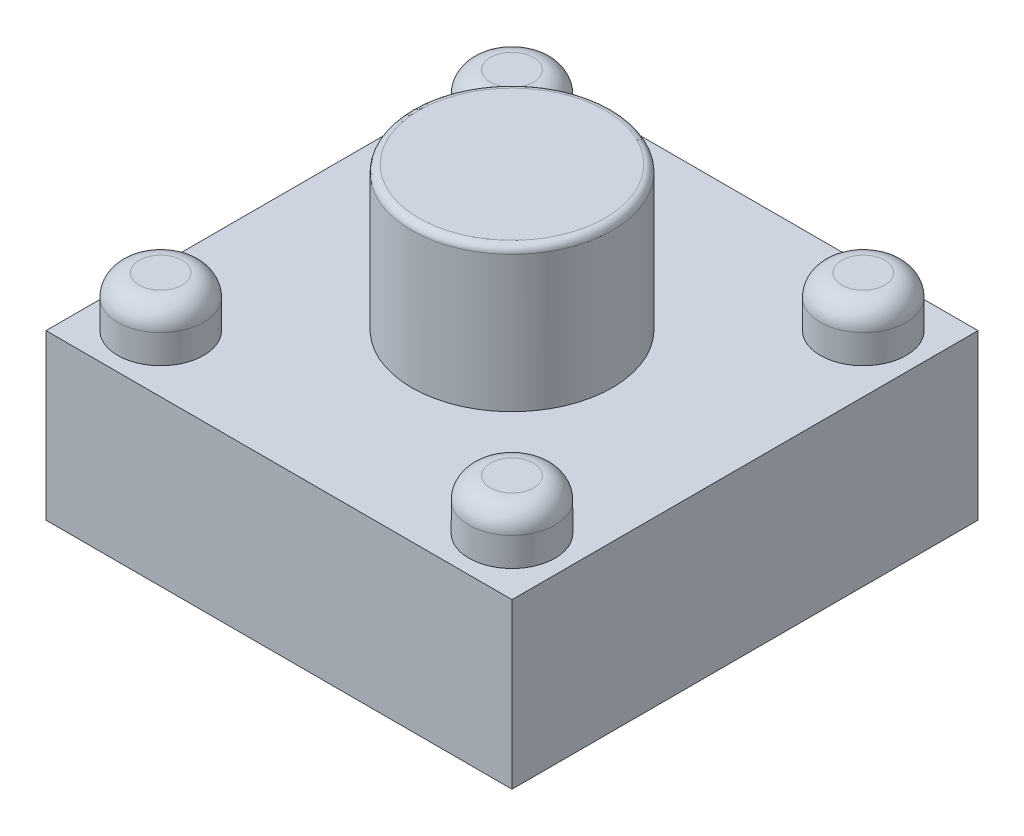
ISO-10303-21;
HEADER;
FILE_DESCRIPTION(('STEP AP214'),'2;1');
FILE_NAME('part.step','',(''),(''),'','','');
FILE_SCHEMA(('AUTOMOTIVE_DESIGN { 1 0 10303 214 1 1 1 1 }'));
ENDSEC;
DATA;
#1=APPLICATION_CONTEXT('core data for automotive mechanical design processes');
#2=APPLICATION_PROTOCOL_DEFINITION('international standard','automotive_design',2000,#1);
#3=PRODUCT_CONTEXT('',#1,'mechanical');
#4=PRODUCT('Part','Part','',(#3));
#5=PRODUCT_RELATED_PRODUCT_CATEGORY('part','',(#4));
#6=PRODUCT_DEFINITION_FORMATION('','',#4);
#7=PRODUCT_DEFINITION_CONTEXT('part definition',#1,'design');
#8=PRODUCT_DEFINITION('design','',#6,#7);
#9=PRODUCT_DEFINITION_SHAPE('','',#8);
#10=(LENGTH_UNIT() NAMED_UNIT(*) SI_UNIT(.MILLI.,.METRE.));
#11=(NAMED_UNIT(*) PLANE_ANGLE_UNIT() SI_UNIT($,.RADIAN.));
#12=(NAMED_UNIT(*) SI_UNIT($,.STERADIAN.) SOLID_ANGLE_UNIT());
#13=UNCERTAINTY_MEASURE_WITH_UNIT(LENGTH_MEASURE(1.E-05),#10,'distance_accuracy_value','');
#14=(GEOMETRIC_REPRESENTATION_CONTEXT(3) GLOBAL_UNCERTAINTY_ASSIGNED_CONTEXT((#13)) GLOBAL_UNIT_ASSIGNED_CONTEXT((#10,
#11,#12)) REPRESENTATION_CONTEXT('',''));
#15=CARTESIAN_POINT('',(0.,0.,0.));
#16=DIRECTION('',(0.,0.,1.));
#17=DIRECTION('',(1.,0.,0.));
#18=AXIS2_PLACEMENT_3D('',#15,#16,#17);
#19=CARTESIAN_POINT('',(0.,4.3,0.));
#20=DIRECTION('',(0.,1.,0.));
#21=DIRECTION('',(0.,0.,1.));
#22=AXIS2_PLACEMENT_3D('',#19,#20,#21);
#23=PLANE('',#22);
#24=CARTESIAN_POINT('',(0.,4.3,0.));
#25=DIRECTION('',(0.,-1.,0.));
#26=DIRECTION('',(0.,0.,-1.));
#27=AXIS2_PLACEMENT_3D('',#24,#25,#26);
#28=CIRCLE('',#27,1.3);
#29=CARTESIAN_POINT('',(0.,4.3,-1.3));
#30=VERTEX_POINT('',#29);
#31=EDGE_CURVE('E21',#30,#30,#28,.T.);
#32=ORIENTED_EDGE('',*,*,#31,.F.);
#33=EDGE_LOOP('',(#32));
#34=FACE_BOUND('',#33,.T.);
#35=ADVANCED_FACE('F17',(#34),#23,.T.);
#36=CARTESIAN_POINT('',(0.,4.2,0.));
#37=DIRECTION('',(0.,-1.,0.));
#38=DIRECTION('',(0.,0.,-1.));
#39=AXIS2_PLACEMENT_3D('',#36,#37,#38);
#40=TOROIDAL_SURFACE('',#39,1.3,0.0999999999999996);
#41=CARTESIAN_POINT('',(0.,4.2,0.));
#42=DIRECTION('',(0.,1.,0.));
#43=DIRECTION('',(0.,0.,1.));
#44=AXIS2_PLACEMENT_3D('',#41,#42,#43);
#45=CIRCLE('',#44,1.4);
#46=CARTESIAN_POINT('',(0.,4.2,1.4));
#47=VERTEX_POINT('',#46);
#48=EDGE_CURVE('E100',#47,#47,#45,.F.);
#49=ORIENTED_EDGE('',*,*,#48,.F.);
#50=EDGE_LOOP('',(#49));
#51=FACE_BOUND('',#50,.T.);
#52=ORIENTED_EDGE('',*,*,#31,.T.);
#53=EDGE_LOOP('',(#52));
#54=FACE_BOUND('',#53,.T.);
#55=ADVANCED_FACE('F137',(#51,#54),#40,.T.);
#56=CARTESIAN_POINT('',(2.45,2.99,2.45));
#57=DIRECTION('',(0.,1.,0.));
#58=DIRECTION('',(0.,0.,1.));
#59=AXIS2_PLACEMENT_3D('',#56,#57,#58);
#60=PLANE('',#59);
#61=CARTESIAN_POINT('',(2.45,2.99,2.45));
#62=DIRECTION('',(0.,-1.,0.));
#63=DIRECTION('',(0.,0.,-1.));
#64=AXIS2_PLACEMENT_3D('',#61,#62,#63);
#65=CIRCLE('',#64,0.3);
#66=CARTESIAN_POINT('',(2.45,2.99,2.15));
#67=VERTEX_POINT('',#66);
#68=EDGE_CURVE('E103',#67,#67,#65,.T.);
#69=ORIENTED_EDGE('',*,*,#68,.F.);
#70=EDGE_LOOP('',(#69));
#71=FACE_BOUND('',#70,.T.);
#72=ADVANCED_FACE('F134',(#71),#60,.T.);
#73=CARTESIAN_POINT('',(2.45,2.99,-2.45));
#74=DIRECTION('',(0.,1.,0.));
#75=DIRECTION('',(0.,0.,1.));
#76=AXIS2_PLACEMENT_3D('',#73,#74,#75);
#77=PLANE('',#76);
#78=CARTESIAN_POINT('',(2.45,2.99,-2.45));
#79=DIRECTION('',(0.,-1.,0.));
#80=DIRECTION('',(0.,0.,-1.));
#81=AXIS2_PLACEMENT_3D('',#78,#79,#80);
#82=CIRCLE('',#81,0.3);
#83=CARTESIAN_POINT('',(2.45,2.99,-2.75));
#84=VERTEX_POINT('',#83);
#85=EDGE_CURVE('E127',#84,#84,#82,.T.);
#86=ORIENTED_EDGE('',*,*,#85,.F.);
#87=EDGE_LOOP('',(#86));
#88=FACE_BOUND('',#87,.T.);
#89=ADVANCED_FACE('F136',(#88),#77,.T.);
#90=CARTESIAN_POINT('',(0.,2.3,0.));
#91=DIRECTION('',(0.,1.,0.));
#92=DIRECTION('',(0.,0.,1.));
#93=AXIS2_PLACEMENT_3D('',#90,#91,#92);
#94=CYLINDRICAL_SURFACE('',#93,1.4);
#95=ORIENTED_EDGE('',*,*,#48,.T.);
#96=EDGE_LOOP('',(#95));
#97=FACE_BOUND('',#96,.T.);
#98=CARTESIAN_POINT('',(0.,2.3,0.));
#99=DIRECTION('',(0.,1.,0.));
#100=DIRECTION('',(0.,0.,1.));
#101=AXIS2_PLACEMENT_3D('',#98,#99,#100);
#102=CIRCLE('',#101,1.4);
#103=CARTESIAN_POINT('',(0.,2.3,1.4));
#104=VERTEX_POINT('',#103);
#105=EDGE_CURVE('E124',#104,#104,#102,.T.);
#106=ORIENTED_EDGE('',*,*,#105,.T.);
#107=EDGE_LOOP('',(#106));
#108=FACE_BOUND('',#107,.T.);
#109=ADVANCED_FACE('F144',(#97,#108),#94,.T.);
#110=CARTESIAN_POINT('',(-2.45,2.99,-2.45));
#111=DIRECTION('',(0.,1.,0.));
#112=DIRECTION('',(0.,0.,1.));
#113=AXIS2_PLACEMENT_3D('',#110,#111,#112);
#114=PLANE('',#113);
#115=CARTESIAN_POINT('',(-2.45,2.99,-2.45));
#116=DIRECTION('',(0.,-1.,0.));
#117=DIRECTION('',(0.,0.,-1.));
#118=AXIS2_PLACEMENT_3D('',#115,#116,#117);
#119=CIRCLE('',#118,0.3);
#120=CARTESIAN_POINT('',(-2.45,2.99,-2.75));
#121=VERTEX_POINT('',#120);
#122=EDGE_CURVE('E121',#121,#121,#119,.T.);
#123=ORIENTED_EDGE('',*,*,#122,.F.);
#124=EDGE_LOOP('',(#123));
#125=FACE_BOUND('',#124,.T.);
#126=ADVANCED_FACE('F200',(#125),#114,.T.);
#127=CARTESIAN_POINT('',(-2.45,2.99,2.45));
#128=DIRECTION('',(0.,1.,0.));
#129=DIRECTION('',(0.,0.,1.));
#130=AXIS2_PLACEMENT_3D('',#127,#128,#129);
#131=PLANE('',#130);
#132=CARTESIAN_POINT('',(-2.45,2.99,2.45));
#133=DIRECTION('',(0.,-1.,0.));
#134=DIRECTION('',(0.,0.,-1.));
#135=AXIS2_PLACEMENT_3D('',#132,#133,#134);
#136=CIRCLE('',#135,0.3);
#137=CARTESIAN_POINT('',(-2.45,2.99,2.15));
#138=VERTEX_POINT('',#137);
#139=EDGE_CURVE('E99',#138,#138,#136,.T.);
#140=ORIENTED_EDGE('',*,*,#139,.F.);
#141=EDGE_LOOP('',(#140));
#142=FACE_BOUND('',#141,.T.);
#143=ADVANCED_FACE('F197',(#142),#131,.T.);
#144=CARTESIAN_POINT('',(2.45,2.69,2.45));
#145=DIRECTION('',(0.,-1.,0.));
#146=DIRECTION('',(0.,0.,-1.));
#147=AXIS2_PLACEMENT_3D('',#144,#145,#146);
#148=DEGENERATE_TOROIDAL_SURFACE('',#147,0.3,0.3,.T.);
#149=CARTESIAN_POINT('',(2.45,2.69,2.45));
#150=DIRECTION('',(0.,1.,0.));
#151=DIRECTION('',(0.,0.,1.));
#152=AXIS2_PLACEMENT_3D('',#149,#150,#151);
#153=CIRCLE('',#152,0.6);
#154=CARTESIAN_POINT('',(2.45,2.69,3.05));
#155=VERTEX_POINT('',#154);
#156=EDGE_CURVE('E96',#155,#155,#153,.F.);
#157=ORIENTED_EDGE('',*,*,#156,.F.);
#158=EDGE_LOOP('',(#157));
#159=FACE_BOUND('',#158,.T.);
#160=ORIENTED_EDGE('',*,*,#68,.T.);
#161=EDGE_LOOP('',(#160));
#162=FACE_BOUND('',#161,.T.);
#163=ADVANCED_FACE('F132',(#159,#162),#148,.T.);
#164=CARTESIAN_POINT('',(2.45,2.69,-2.45));
#165=DIRECTION('',(0.,-1.,0.));
#166=DIRECTION('',(0.,0.,-1.));
#167=AXIS2_PLACEMENT_3D('',#164,#165,#166);
#168=DEGENERATE_TOROIDAL_SURFACE('',#167,0.3,0.3,.T.);
#169=CARTESIAN_POINT('',(2.45,2.69,-2.45));
#170=DIRECTION('',(0.,1.,0.));
#171=DIRECTION('',(0.,0.,1.));
#172=AXIS2_PLACEMENT_3D('',#169,#170,#171);
#173=CIRCLE('',#172,0.6);
#174=CARTESIAN_POINT('',(2.45,2.69,-1.85));
#175=VERTEX_POINT('',#174);
#176=EDGE_CURVE('E93',#175,#175,#173,.F.);
#177=ORIENTED_EDGE('',*,*,#176,.F.);
#178=EDGE_LOOP('',(#177));
#179=FACE_BOUND('',#178,.T.);
#180=ORIENTED_EDGE('',*,*,#85,.T.);
#181=EDGE_LOOP('',(#180));
#182=FACE_BOUND('',#181,.T.);
#183=ADVANCED_FACE('F195',(#179,#182),#168,.T.);
#184=CARTESIAN_POINT('',(0.,2.3,0.));
#185=DIRECTION('',(0.,1.,0.));
#186=DIRECTION('',(0.,0.,1.));
#187=AXIS2_PLACEMENT_3D('',#184,#185,#186);
#188=PLANE('',#187);
#189=ORIENTED_EDGE('',*,*,#105,.F.);
#190=EDGE_LOOP('',(#189));
#191=FACE_BOUND('',#190,.T.);
#192=CARTESIAN_POINT('',(0.,2.3,0.));
#193=DIRECTION('',(0.,1.,0.));
#194=DIRECTION('',(0.,0.,1.));
#195=AXIS2_PLACEMENT_3D('',#192,#193,#194);
#196=CIRCLE('',#195,0.4);
#197=CARTESIAN_POINT('',(0.,2.3,0.4));
#198=VERTEX_POINT('',#197);
#199=EDGE_CURVE('E92',#198,#198,#196,.F.);
#200=ORIENTED_EDGE('',*,*,#199,.F.);
#201=EDGE_LOOP('',(#200));
#202=FACE_BOUND('',#201,.T.);
#203=ADVANCED_FACE('F191',(#191,#202),#188,.F.);
#204=CARTESIAN_POINT('',(-2.45,2.69,-2.45));
#205=DIRECTION('',(0.,-1.,0.));
#206=DIRECTION('',(0.,0.,-1.));
#207=AXIS2_PLACEMENT_3D('',#204,#205,#206);
#208=DEGENERATE_TOROIDAL_SURFACE('',#207,0.3,0.3,.T.);
#209=CARTESIAN_POINT('',(-2.45,2.69,-2.45));
#210=DIRECTION('',(0.,1.,0.));
#211=DIRECTION('',(0.,0.,1.));
#212=AXIS2_PLACEMENT_3D('',#209,#210,#211);
#213=CIRCLE('',#212,0.6);
#214=CARTESIAN_POINT('',(-2.45,2.69,-1.85));
#215=VERTEX_POINT('',#214);
#216=EDGE_CURVE('E89',#215,#215,#213,.F.);
#217=ORIENTED_EDGE('',*,*,#216,.F.);
#218=EDGE_LOOP('',(#217));
#219=FACE_BOUND('',#218,.T.);
#220=ORIENTED_EDGE('',*,*,#122,.T.);
#221=EDGE_LOOP('',(#220));
#222=FACE_BOUND('',#221,.T.);
#223=ADVANCED_FACE('F194',(#219,#222),#208,.T.);
#224=CARTESIAN_POINT('',(-2.45,2.69,2.45));
#225=DIRECTION('',(0.,-1.,0.));
#226=DIRECTION('',(0.,0.,-1.));
#227=AXIS2_PLACEMENT_3D('',#224,#225,#226);
#228=DEGENERATE_TOROIDAL_SURFACE('',#227,0.3,0.3,.T.);
#229=CARTESIAN_POINT('',(-2.45,2.69,2.45));
#230=DIRECTION('',(0.,1.,0.));
#231=DIRECTION('',(0.,0.,1.));
#232=AXIS2_PLACEMENT_3D('',#229,#230,#231);
#233=CIRCLE('',#232,0.6);
#234=CARTESIAN_POINT('',(-2.45,2.69,3.05));
#235=VERTEX_POINT('',#234);
#236=EDGE_CURVE('E85',#235,#235,#233,.F.);
#237=ORIENTED_EDGE('',*,*,#236,.F.);
#238=EDGE_LOOP('',(#237));
#239=FACE_BOUND('',#238,.T.);
#240=ORIENTED_EDGE('',*,*,#139,.T.);
#241=EDGE_LOOP('',(#240));
#242=FACE_BOUND('',#241,.T.);
#243=ADVANCED_FACE('F19',(#239,#242),#228,.T.);
#244=CARTESIAN_POINT('',(2.45,2.29,2.45));
#245=DIRECTION('',(0.,1.,0.));
#246=DIRECTION('',(0.,0.,1.));
#247=AXIS2_PLACEMENT_3D('',#244,#245,#246);
#248=CYLINDRICAL_SURFACE('',#247,0.6);
#249=ORIENTED_EDGE('',*,*,#156,.T.);
#250=EDGE_LOOP('',(#249));
#251=FACE_BOUND('',#250,.T.);
#252=CARTESIAN_POINT('',(2.45,2.29,2.45));
#253=DIRECTION('',(0.,1.,0.));
#254=DIRECTION('',(0.,0.,1.));
#255=AXIS2_PLACEMENT_3D('',#252,#253,#254);
#256=CIRCLE('',#255,0.6);
#257=CARTESIAN_POINT('',(2.45,2.29,3.05));
#258=VERTEX_POINT('',#257);
#259=EDGE_CURVE('E88',#258,#258,#256,.F.);
#260=ORIENTED_EDGE('',*,*,#259,.F.);
#261=EDGE_LOOP('',(#260));
#262=FACE_BOUND('',#261,.T.);
#263=ADVANCED_FACE('F186',(#251,#262),#248,.T.);
#264=CARTESIAN_POINT('',(2.45,2.29,-2.45));
#265=DIRECTION('',(0.,1.,0.));
#266=DIRECTION('',(0.,0.,1.));
#267=AXIS2_PLACEMENT_3D('',#264,#265,#266);
#268=CYLINDRICAL_SURFACE('',#267,0.6);
#269=ORIENTED_EDGE('',*,*,#176,.T.);
#270=EDGE_LOOP('',(#269));
#271=FACE_BOUND('',#270,.T.);
#272=CARTESIAN_POINT('',(2.45,2.29,-2.45));
#273=DIRECTION('',(0.,1.,0.));
#274=DIRECTION('',(0.,0.,1.));
#275=AXIS2_PLACEMENT_3D('',#272,#273,#274);
#276=CIRCLE('',#275,0.6);
#277=CARTESIAN_POINT('',(2.45,2.29,-1.85));
#278=VERTEX_POINT('',#277);
#279=EDGE_CURVE('E112',#278,#278,#276,.F.);
#280=ORIENTED_EDGE('',*,*,#279,.F.);
#281=EDGE_LOOP('',(#280));
#282=FACE_BOUND('',#281,.T.);
#283=ADVANCED_FACE('F182',(#271,#282),#268,.T.);
#284=CARTESIAN_POINT('',(0.,2.29,0.));
#285=DIRECTION('',(0.,1.,0.));
#286=DIRECTION('',(0.,0.,1.));
#287=AXIS2_PLACEMENT_3D('',#284,#285,#286);
#288=CYLINDRICAL_SURFACE('',#287,0.4);
#289=ORIENTED_EDGE('',*,*,#199,.T.);
#290=EDGE_LOOP('',(#289));
#291=FACE_BOUND('',#290,.T.);
#292=CARTESIAN_POINT('',(0.,2.29,0.));
#293=DIRECTION('',(0.,1.,0.));
#294=DIRECTION('',(0.,0.,1.));
#295=AXIS2_PLACEMENT_3D('',#292,#293,#294);
#296=CIRCLE('',#295,0.4);
#297=CARTESIAN_POINT('',(0.,2.29,0.4));
#298=VERTEX_POINT('',#297);
#299=EDGE_CURVE('E109',#298,#298,#296,.F.);
#300=ORIENTED_EDGE('',*,*,#299,.F.);
#301=EDGE_LOOP('',(#300));
#302=FACE_BOUND('',#301,.T.);
#303=ADVANCED_FACE('F178',(#291,#302),#288,.T.);
#304=CARTESIAN_POINT('',(-2.45,2.29,-2.45));
#305=DIRECTION('',(0.,1.,0.));
#306=DIRECTION('',(0.,0.,1.));
#307=AXIS2_PLACEMENT_3D('',#304,#305,#306);
#308=CYLINDRICAL_SURFACE('',#307,0.6);
#309=ORIENTED_EDGE('',*,*,#216,.T.);
#310=EDGE_LOOP('',(#309));
#311=FACE_BOUND('',#310,.T.);
#312=CARTESIAN_POINT('',(-2.45,2.29,-2.45));
#313=DIRECTION('',(0.,1.,0.));
#314=DIRECTION('',(0.,0.,1.));
#315=AXIS2_PLACEMENT_3D('',#312,#313,#314);
#316=CIRCLE('',#315,0.6);
#317=CARTESIAN_POINT('',(-2.45,2.29,-1.85));
#318=VERTEX_POINT('',#317);
#319=EDGE_CURVE('E106',#318,#318,#316,.F.);
#320=ORIENTED_EDGE('',*,*,#319,.F.);
#321=EDGE_LOOP('',(#320));
#322=FACE_BOUND('',#321,.T.);
#323=ADVANCED_FACE('F174',(#311,#322),#308,.T.);
#324=CARTESIAN_POINT('',(-2.45,2.29,2.45));
#325=DIRECTION('',(0.,1.,0.));
#326=DIRECTION('',(0.,0.,1.));
#327=AXIS2_PLACEMENT_3D('',#324,#325,#326);
#328=CYLINDRICAL_SURFACE('',#327,0.6);
#329=ORIENTED_EDGE('',*,*,#236,.T.);
#330=EDGE_LOOP('',(#329));
#331=FACE_BOUND('',#330,.T.);
#332=CARTESIAN_POINT('',(-2.45,2.29,2.45));
#333=DIRECTION('',(0.,1.,0.));
#334=DIRECTION('',(0.,0.,1.));
#335=AXIS2_PLACEMENT_3D('',#332,#333,#334);
#336=CIRCLE('',#335,0.6);
#337=CARTESIAN_POINT('',(-2.45,2.29,3.05));
#338=VERTEX_POINT('',#337);
#339=EDGE_CURVE('E76',#338,#338,#336,.F.);
#340=ORIENTED_EDGE('',*,*,#339,.F.);
#341=EDGE_LOOP('',(#340));
#342=FACE_BOUND('',#341,.T.);
#343=ADVANCED_FACE('F170',(#331,#342),#328,.T.);
#344=CARTESIAN_POINT('',(0.,2.29,0.));
#345=DIRECTION('',(0.,1.,0.));
#346=DIRECTION('',(0.,0.,1.));
#347=AXIS2_PLACEMENT_3D('',#344,#345,#346);
#348=PLANE('',#347);
#349=ORIENTED_EDGE('',*,*,#339,.T.);
#350=EDGE_LOOP('',(#349));
#351=FACE_BOUND('',#350,.T.);
#352=ORIENTED_EDGE('',*,*,#319,.T.);
#353=EDGE_LOOP('',(#352));
#354=FACE_BOUND('',#353,.T.);
#355=ORIENTED_EDGE('',*,*,#299,.T.);
#356=EDGE_LOOP('',(#355));
#357=FACE_BOUND('',#356,.T.);
#358=ORIENTED_EDGE('',*,*,#279,.T.);
#359=EDGE_LOOP('',(#358));
#360=FACE_BOUND('',#359,.T.);
#361=ORIENTED_EDGE('',*,*,#259,.T.);
#362=EDGE_LOOP('',(#361));
#363=FACE_BOUND('',#362,.T.);
#364=DIRECTION('',(-1.,0.,0.));
#365=VECTOR('',#364,1.);
#366=CARTESIAN_POINT('',(0.,2.29,-3.25));
#367=LINE('',#366,#365);
#368=CARTESIAN_POINT('',(-3.25,2.29,-3.25));
#369=VERTEX_POINT('',#368);
#370=CARTESIAN_POINT('',(3.25,2.29,-3.25));
#371=VERTEX_POINT('',#370);
#372=EDGE_CURVE('E72',#369,#371,#367,.F.);
#373=ORIENTED_EDGE('',*,*,#372,.F.);
#374=DIRECTION('',(0.,0.,1.));
#375=VECTOR('',#374,1.);
#376=CARTESIAN_POINT('',(-3.25,2.29,0.));
#377=LINE('',#376,#375);
#378=CARTESIAN_POINT('',(-3.25,2.29,3.25));
#379=VERTEX_POINT('',#378);
#380=EDGE_CURVE('E68',#379,#369,#377,.F.);
#381=ORIENTED_EDGE('',*,*,#380,.F.);
#382=DIRECTION('',(1.,0.,0.));
#383=VECTOR('',#382,1.);
#384=CARTESIAN_POINT('',(0.,2.29,3.25));
#385=LINE('',#384,#383);
#386=CARTESIAN_POINT('',(3.25,2.29,3.25));
#387=VERTEX_POINT('',#386);
#388=EDGE_CURVE('E59',#387,#379,#385,.F.);
#389=ORIENTED_EDGE('',*,*,#388,.F.);
#390=DIRECTION('',(0.,0.,-1.));
#391=VECTOR('',#390,1.);
#392=CARTESIAN_POINT('',(3.25,2.29,0.));
#393=LINE('',#392,#391);
#394=EDGE_CURVE('E54',#371,#387,#393,.F.);
#395=ORIENTED_EDGE('',*,*,#394,.F.);
#396=EDGE_LOOP('',(#373,#381,#389,#395));
#397=FACE_BOUND('',#396,.T.);
#398=ADVANCED_FACE('F71',(#351,#354,#357,#360,#363,#397),#348,.T.);
#399=CARTESIAN_POINT('',(-3.25,0.,0.));
#400=DIRECTION('',(-1.,0.,0.));
#401=DIRECTION('',(0.,0.,1.));
#402=AXIS2_PLACEMENT_3D('',#399,#400,#401);
#403=PLANE('',#402);
#404=ORIENTED_EDGE('',*,*,#380,.T.);
#405=DIRECTION('',(0.,1.,0.));
#406=VECTOR('',#405,1.);
#407=CARTESIAN_POINT('',(-3.25,0.,-3.25));
#408=LINE('',#407,#406);
#409=CARTESIAN_POINT('',(-3.25,0.,-3.25));
#410=VERTEX_POINT('',#409);
#411=EDGE_CURVE('E400',#410,#369,#408,.T.);
#412=ORIENTED_EDGE('',*,*,#411,.F.);
#413=DIRECTION('',(0.,0.,1.));
#414=VECTOR('',#413,1.);
#415=CARTESIAN_POINT('',(-3.25,0.,0.));
#416=LINE('',#415,#414);
#417=CARTESIAN_POINT('',(-3.25,0.,3.25));
#418=VERTEX_POINT('',#417);
#419=EDGE_CURVE('E80',#410,#418,#416,.T.);
#420=ORIENTED_EDGE('',*,*,#419,.T.);
#421=DIRECTION('',(0.,1.,0.));
#422=VECTOR('',#421,1.);
#423=CARTESIAN_POINT('',(-3.25,0.,3.25));
#424=LINE('',#423,#422);
#425=EDGE_CURVE('E64',#379,#418,#424,.F.);
#426=ORIENTED_EDGE('',*,*,#425,.F.);
#427=EDGE_LOOP('',(#404,#412,#420,#426));
#428=FACE_BOUND('',#427,.T.);
#429=ADVANCED_FACE('F79',(#428),#403,.T.);
#430=CARTESIAN_POINT('',(0.,0.,3.25));
#431=DIRECTION('',(0.,0.,1.));
#432=DIRECTION('',(1.,0.,0.));
#433=AXIS2_PLACEMENT_3D('',#430,#431,#432);
#434=PLANE('',#433);
#435=ORIENTED_EDGE('',*,*,#388,.T.);
#436=ORIENTED_EDGE('',*,*,#425,.T.);
#437=DIRECTION('',(1.,0.,0.));
#438=VECTOR('',#437,1.);
#439=CARTESIAN_POINT('',(0.,0.,3.25));
#440=LINE('',#439,#438);
#441=CARTESIAN_POINT('',(3.25,0.,3.25));
#442=VERTEX_POINT('',#441);
#443=EDGE_CURVE('E393',#418,#442,#440,.T.);
#444=ORIENTED_EDGE('',*,*,#443,.T.);
#445=DIRECTION('',(0.,1.,0.));
#446=VECTOR('',#445,1.);
#447=CARTESIAN_POINT('',(3.25,0.,3.25));
#448=LINE('',#447,#446);
#449=EDGE_CURVE('E66',#387,#442,#448,.F.);
#450=ORIENTED_EDGE('',*,*,#449,.F.);
#451=EDGE_LOOP('',(#435,#436,#444,#450));
#452=FACE_BOUND('',#451,.T.);
#453=ADVANCED_FACE('F61',(#452),#434,.T.);
#454=CARTESIAN_POINT('',(3.25,0.,0.));
#455=DIRECTION('',(1.,0.,0.));
#456=DIRECTION('',(0.,0.,-1.));
#457=AXIS2_PLACEMENT_3D('',#454,#455,#456);
#458=PLANE('',#457);
#459=ORIENTED_EDGE('',*,*,#394,.T.);
#460=ORIENTED_EDGE('',*,*,#449,.T.);
#461=DIRECTION('',(0.,0.,1.));
#462=VECTOR('',#461,1.);
#463=CARTESIAN_POINT('',(3.25,0.,0.));
#464=LINE('',#463,#462);
#465=CARTESIAN_POINT('',(3.25,0.,-3.25));
#466=VERTEX_POINT('',#465);
#467=EDGE_CURVE('E27',#442,#466,#464,.F.);
#468=ORIENTED_EDGE('',*,*,#467,.T.);
#469=DIRECTION('',(0.,1.,0.));
#470=VECTOR('',#469,1.);
#471=CARTESIAN_POINT('',(3.25,0.,-3.25));
#472=LINE('',#471,#470);
#473=EDGE_CURVE('E35',#371,#466,#472,.F.);
#474=ORIENTED_EDGE('',*,*,#473,.F.);
#475=EDGE_LOOP('',(#459,#460,#468,#474));
#476=FACE_BOUND('',#475,.T.);
#477=ADVANCED_FACE('F158',(#476),#458,.T.);
#478=CARTESIAN_POINT('',(0.,0.,-3.25));
#479=DIRECTION('',(0.,0.,-1.));
#480=DIRECTION('',(-1.,0.,0.));
#481=AXIS2_PLACEMENT_3D('',#478,#479,#480);
#482=PLANE('',#481);
#483=ORIENTED_EDGE('',*,*,#372,.T.);
#484=ORIENTED_EDGE('',*,*,#473,.T.);
#485=DIRECTION('',(1.,0.,0.));
#486=VECTOR('',#485,1.);
#487=CARTESIAN_POINT('',(0.,0.,-3.25));
#488=LINE('',#487,#486);
#489=EDGE_CURVE('E11',#466,#410,#488,.F.);
#490=ORIENTED_EDGE('',*,*,#489,.T.);
#491=ORIENTED_EDGE('',*,*,#411,.T.);
#492=EDGE_LOOP('',(#483,#484,#490,#491));
#493=FACE_BOUND('',#492,.T.);
#494=ADVANCED_FACE('F152',(#493),#482,.T.);
#495=CARTESIAN_POINT('',(0.,0.,0.));
#496=DIRECTION('',(0.,1.,0.));
#497=DIRECTION('',(0.,0.,1.));
#498=AXIS2_PLACEMENT_3D('',#495,#496,#497);
#499=PLANE('',#498);
#500=ORIENTED_EDGE('',*,*,#467,.F.);
#501=ORIENTED_EDGE('',*,*,#443,.F.);
#502=ORIENTED_EDGE('',*,*,#419,.F.);
#503=ORIENTED_EDGE('',*,*,#489,.F.);
#504=EDGE_LOOP('',(#500,#501,#502,#503));
#505=FACE_BOUND('',#504,.T.);
#506=ADVANCED_FACE('F150',(#505),#499,.F.);
#507=CLOSED_SHELL('',(#35,#55,#72,#89,#109,#126,#143,#163,#183,#203,#223,#243,#263,#283,#303,
#323,#343,#398,#429,#453,#477,#494,#506));
#508=MANIFOLD_SOLID_BREP('B1',#507);
#509=ADVANCED_BREP_SHAPE_REPRESENTATION('',(#18,#508),#14);
#510=SHAPE_DEFINITION_REPRESENTATION(#9,#509);
ENDSEC;
END-ISO-10303-21;
